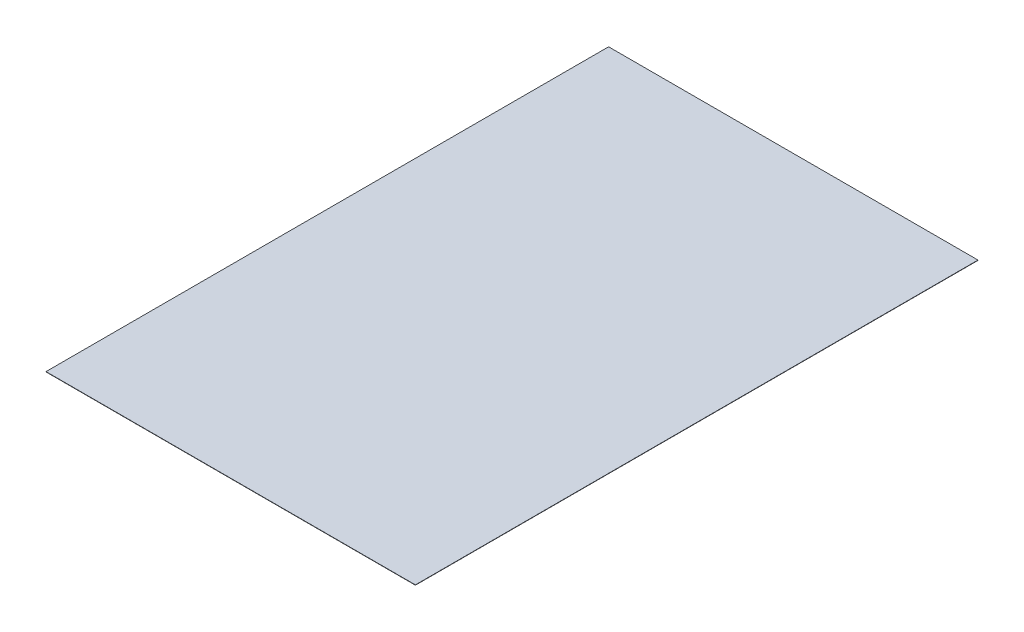
ISO-10303-21;
HEADER;
FILE_DESCRIPTION(('STEP AP214'),'2;1');
FILE_NAME('part.step','',(''),(''),'','','');
FILE_SCHEMA(('AUTOMOTIVE_DESIGN { 1 0 10303 214 1 1 1 1 }'));
ENDSEC;
DATA;
#1=APPLICATION_CONTEXT('core data for automotive mechanical design processes');
#2=APPLICATION_PROTOCOL_DEFINITION('international standard','automotive_design',2000,#1);
#3=PRODUCT_CONTEXT('',#1,'mechanical');
#4=PRODUCT('Part','Part','',(#3));
#5=PRODUCT_RELATED_PRODUCT_CATEGORY('part','',(#4));
#6=PRODUCT_DEFINITION_FORMATION('','',#4);
#7=PRODUCT_DEFINITION_CONTEXT('part definition',#1,'design');
#8=PRODUCT_DEFINITION('design','',#6,#7);
#9=PRODUCT_DEFINITION_SHAPE('','',#8);
#10=(LENGTH_UNIT() NAMED_UNIT(*) SI_UNIT(.MILLI.,.METRE.));
#11=(NAMED_UNIT(*) PLANE_ANGLE_UNIT() SI_UNIT($,.RADIAN.));
#12=(NAMED_UNIT(*) SI_UNIT($,.STERADIAN.) SOLID_ANGLE_UNIT());
#13=UNCERTAINTY_MEASURE_WITH_UNIT(LENGTH_MEASURE(1.E-05),#10,'distance_accuracy_value','');
#14=(GEOMETRIC_REPRESENTATION_CONTEXT(3) GLOBAL_UNCERTAINTY_ASSIGNED_CONTEXT((#13)) GLOBAL_UNIT_ASSIGNED_CONTEXT((#10,
#11,#12)) REPRESENTATION_CONTEXT('',''));
#15=CARTESIAN_POINT('',(0.,0.,0.));
#16=DIRECTION('',(0.,0.,1.));
#17=DIRECTION('',(1.,0.,0.));
#18=AXIS2_PLACEMENT_3D('',#15,#16,#17);
#19=CARTESIAN_POINT('',(31.72,15.55,-48.308));
#20=DIRECTION('',(0.,1.,0.));
#21=DIRECTION('',(-1.,0.,0.));
#22=AXIS2_PLACEMENT_3D('',#19,#20,#21);
#23=PLANE('',#22);
#24=DIRECTION('',(0.,0.,-1.));
#25=VECTOR('',#24,1.);
#26=CARTESIAN_POINT('',(-30.5,15.55,0.));
#27=LINE('',#26,#25);
#28=CARTESIAN_POINT('',(-30.5,15.55,46.45));
#29=VERTEX_POINT('',#28);
#30=CARTESIAN_POINT('',(-30.5,15.55,-46.45));
#31=VERTEX_POINT('',#30);
#32=EDGE_CURVE('E54',#29,#31,#27,.T.);
#33=ORIENTED_EDGE('',*,*,#32,.F.);
#34=DIRECTION('',(-1.,0.,0.));
#35=VECTOR('',#34,1.);
#36=CARTESIAN_POINT('',(0.,15.55,46.45));
#37=LINE('',#36,#35);
#38=CARTESIAN_POINT('',(30.5,15.55,46.45));
#39=VERTEX_POINT('',#38);
#40=EDGE_CURVE('E69',#39,#29,#37,.T.);
#41=ORIENTED_EDGE('',*,*,#40,.F.);
#42=DIRECTION('',(0.,0.,1.));
#43=VECTOR('',#42,1.);
#44=CARTESIAN_POINT('',(30.5,15.55,0.));
#45=LINE('',#44,#43);
#46=CARTESIAN_POINT('',(30.5,15.55,-46.45));
#47=VERTEX_POINT('',#46);
#48=EDGE_CURVE('E21',#47,#39,#45,.T.);
#49=ORIENTED_EDGE('',*,*,#48,.F.);
#50=DIRECTION('',(1.,0.,0.));
#51=VECTOR('',#50,1.);
#52=CARTESIAN_POINT('',(0.,15.55,-46.45));
#53=LINE('',#52,#51);
#54=EDGE_CURVE('E59',#31,#47,#53,.T.);
#55=ORIENTED_EDGE('',*,*,#54,.F.);
#56=EDGE_LOOP('',(#33,#41,#49,#55));
#57=FACE_BOUND('',#56,.T.);
#58=ADVANCED_FACE('F17',(#57),#23,.T.);
#59=CARTESIAN_POINT('',(30.5,15.499,48.308));
#60=DIRECTION('',(1.,0.,0.));
#61=DIRECTION('',(0.,0.,-1.));
#62=AXIS2_PLACEMENT_3D('',#59,#60,#61);
#63=PLANE('',#62);
#64=ORIENTED_EDGE('',*,*,#48,.T.);
#65=DIRECTION('',(0.,1.,0.));
#66=VECTOR('',#65,1.);
#67=CARTESIAN_POINT('',(30.5,15.525,46.45));
#68=LINE('',#67,#66);
#69=CARTESIAN_POINT('',(30.5,15.5,46.45));
#70=VERTEX_POINT('',#69);
#71=EDGE_CURVE('E80',#70,#39,#68,.T.);
#72=ORIENTED_EDGE('',*,*,#71,.F.);
#73=DIRECTION('',(0.,0.,-1.));
#74=VECTOR('',#73,1.);
#75=CARTESIAN_POINT('',(30.5,15.5,0.));
#76=LINE('',#75,#74);
#77=CARTESIAN_POINT('',(30.5,15.5,-46.45));
#78=VERTEX_POINT('',#77);
#79=EDGE_CURVE('E75',#70,#78,#76,.T.);
#80=ORIENTED_EDGE('',*,*,#79,.T.);
#81=DIRECTION('',(0.,-1.,0.));
#82=VECTOR('',#81,1.);
#83=CARTESIAN_POINT('',(30.5,15.525,-46.45));
#84=LINE('',#83,#82);
#85=EDGE_CURVE('E64',#47,#78,#84,.T.);
#86=ORIENTED_EDGE('',*,*,#85,.F.);
#87=EDGE_LOOP('',(#64,#72,#80,#86));
#88=FACE_BOUND('',#87,.T.);
#89=ADVANCED_FACE('F74',(#88),#63,.T.);
#90=CARTESIAN_POINT('',(31.72,15.499,-46.45));
#91=DIRECTION('',(0.,0.,-1.));
#92=DIRECTION('',(-1.,0.,0.));
#93=AXIS2_PLACEMENT_3D('',#90,#91,#92);
#94=PLANE('',#93);
#95=ORIENTED_EDGE('',*,*,#54,.T.);
#96=ORIENTED_EDGE('',*,*,#85,.T.);
#97=DIRECTION('',(-1.,0.,0.));
#98=VECTOR('',#97,1.);
#99=CARTESIAN_POINT('',(0.,15.5,-46.45));
#100=LINE('',#99,#98);
#101=CARTESIAN_POINT('',(-30.5,15.5,-46.45));
#102=VERTEX_POINT('',#101);
#103=EDGE_CURVE('E85',#78,#102,#100,.T.);
#104=ORIENTED_EDGE('',*,*,#103,.T.);
#105=DIRECTION('',(0.,-1.,0.));
#106=VECTOR('',#105,1.);
#107=CARTESIAN_POINT('',(-30.5,15.525,-46.45));
#108=LINE('',#107,#106);
#109=EDGE_CURVE('E66',#31,#102,#108,.T.);
#110=ORIENTED_EDGE('',*,*,#109,.F.);
#111=EDGE_LOOP('',(#95,#96,#104,#110));
#112=FACE_BOUND('',#111,.T.);
#113=ADVANCED_FACE('F61',(#112),#94,.T.);
#114=CARTESIAN_POINT('',(-30.5,15.499,-48.308));
#115=DIRECTION('',(-1.,0.,0.));
#116=DIRECTION('',(0.,0.,1.));
#117=AXIS2_PLACEMENT_3D('',#114,#115,#116);
#118=PLANE('',#117);
#119=ORIENTED_EDGE('',*,*,#32,.T.);
#120=ORIENTED_EDGE('',*,*,#109,.T.);
#121=DIRECTION('',(0.,0.,1.));
#122=VECTOR('',#121,1.);
#123=CARTESIAN_POINT('',(-30.5,15.5,0.));
#124=LINE('',#123,#122);
#125=CARTESIAN_POINT('',(-30.5,15.5,46.45));
#126=VERTEX_POINT('',#125);
#127=EDGE_CURVE('E27',#102,#126,#124,.T.);
#128=ORIENTED_EDGE('',*,*,#127,.T.);
#129=DIRECTION('',(0.,-1.,0.));
#130=VECTOR('',#129,1.);
#131=CARTESIAN_POINT('',(-30.5,15.525,46.45));
#132=LINE('',#131,#130);
#133=EDGE_CURVE('E35',#29,#126,#132,.T.);
#134=ORIENTED_EDGE('',*,*,#133,.F.);
#135=EDGE_LOOP('',(#119,#120,#128,#134));
#136=FACE_BOUND('',#135,.T.);
#137=ADVANCED_FACE('F89',(#136),#118,.T.);
#138=CARTESIAN_POINT('',(-31.72,15.499,46.45));
#139=DIRECTION('',(0.,0.,1.));
#140=DIRECTION('',(1.,0.,0.));
#141=AXIS2_PLACEMENT_3D('',#138,#139,#140);
#142=PLANE('',#141);
#143=ORIENTED_EDGE('',*,*,#40,.T.);
#144=ORIENTED_EDGE('',*,*,#133,.T.);
#145=DIRECTION('',(1.,0.,0.));
#146=VECTOR('',#145,1.);
#147=CARTESIAN_POINT('',(0.,15.5,46.45));
#148=LINE('',#147,#146);
#149=EDGE_CURVE('E11',#126,#70,#148,.T.);
#150=ORIENTED_EDGE('',*,*,#149,.T.);
#151=ORIENTED_EDGE('',*,*,#71,.T.);
#152=EDGE_LOOP('',(#143,#144,#150,#151));
#153=FACE_BOUND('',#152,.T.);
#154=ADVANCED_FACE('F91',(#153),#142,.T.);
#155=CARTESIAN_POINT('',(31.72,15.5,-48.308));
#156=DIRECTION('',(0.,1.,0.));
#157=DIRECTION('',(-1.,0.,0.));
#158=AXIS2_PLACEMENT_3D('',#155,#156,#157);
#159=PLANE('',#158);
#160=ORIENTED_EDGE('',*,*,#127,.F.);
#161=ORIENTED_EDGE('',*,*,#103,.F.);
#162=ORIENTED_EDGE('',*,*,#79,.F.);
#163=ORIENTED_EDGE('',*,*,#149,.F.);
#164=EDGE_LOOP('',(#160,#161,#162,#163));
#165=FACE_BOUND('',#164,.T.);
#166=ADVANCED_FACE('F19',(#165),#159,.F.);
#167=CLOSED_SHELL('',(#58,#89,#113,#137,#154,#166));
#168=MANIFOLD_SOLID_BREP('B1',#167);
#169=ADVANCED_BREP_SHAPE_REPRESENTATION('',(#18,#168),#14);
#170=SHAPE_DEFINITION_REPRESENTATION(#9,#169);
ENDSEC;
END-ISO-10303-21;
